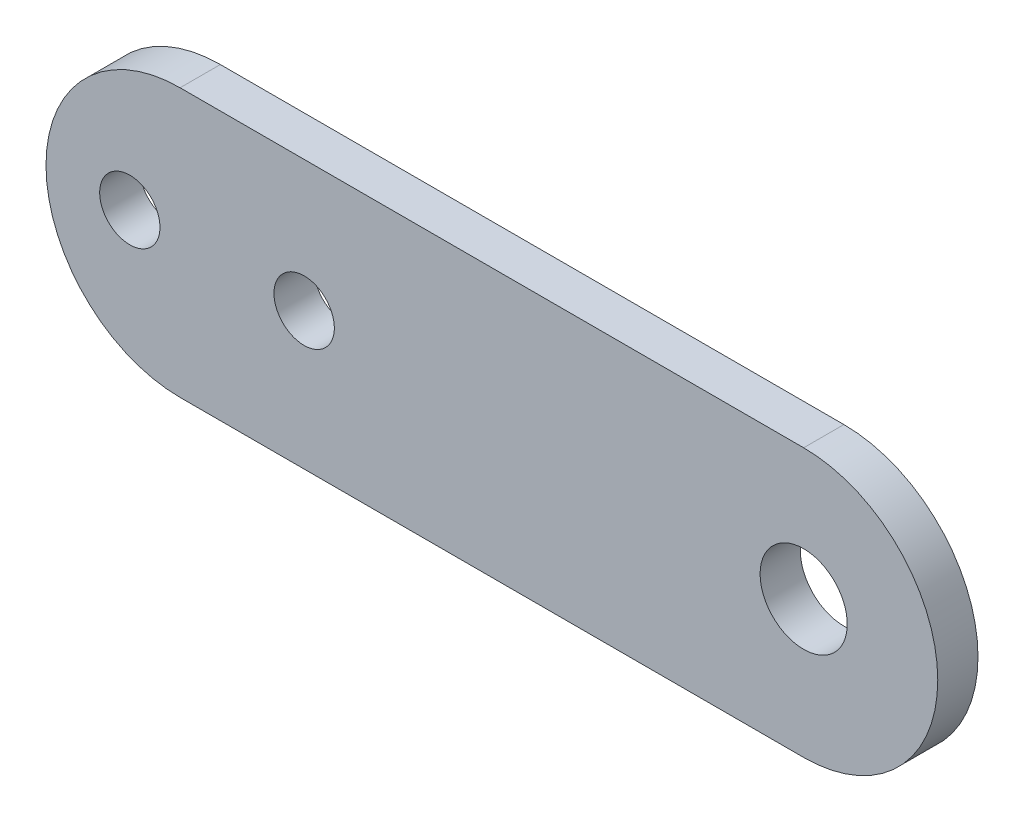
ISO-10303-21;
HEADER;
FILE_DESCRIPTION(('STEP AP214'),'2;1');
FILE_NAME('part.step','',(''),(''),'','','');
FILE_SCHEMA(('AUTOMOTIVE_DESIGN { 1 0 10303 214 1 1 1 1 }'));
ENDSEC;
DATA;
#1=APPLICATION_CONTEXT('core data for automotive mechanical design processes');
#2=APPLICATION_PROTOCOL_DEFINITION('international standard','automotive_design',2000,#1);
#3=PRODUCT_CONTEXT('',#1,'mechanical');
#4=PRODUCT('Part','Part','',(#3));
#5=PRODUCT_RELATED_PRODUCT_CATEGORY('part','',(#4));
#6=PRODUCT_DEFINITION_FORMATION('','',#4);
#7=PRODUCT_DEFINITION_CONTEXT('part definition',#1,'design');
#8=PRODUCT_DEFINITION('design','',#6,#7);
#9=PRODUCT_DEFINITION_SHAPE('','',#8);
#10=(LENGTH_UNIT() NAMED_UNIT(*) SI_UNIT(.MILLI.,.METRE.));
#11=(NAMED_UNIT(*) PLANE_ANGLE_UNIT() SI_UNIT($,.RADIAN.));
#12=(NAMED_UNIT(*) SI_UNIT($,.STERADIAN.) SOLID_ANGLE_UNIT());
#13=UNCERTAINTY_MEASURE_WITH_UNIT(LENGTH_MEASURE(1.E-05),#10,'distance_accuracy_value','');
#14=(GEOMETRIC_REPRESENTATION_CONTEXT(3) GLOBAL_UNCERTAINTY_ASSIGNED_CONTEXT((#13)) GLOBAL_UNIT_ASSIGNED_CONTEXT((#10,
#11,#12)) REPRESENTATION_CONTEXT('',''));
#15=CARTESIAN_POINT('',(0.,0.,0.));
#16=DIRECTION('',(0.,0.,1.));
#17=DIRECTION('',(1.,0.,0.));
#18=AXIS2_PLACEMENT_3D('',#15,#16,#17);
#19=CARTESIAN_POINT('',(-23.25,-0.231386828024561,3.));
#20=DIRECTION('',(0.,0.,-1.));
#21=DIRECTION('',(-1.,0.,0.));
#22=AXIS2_PLACEMENT_3D('',#19,#20,#21);
#23=CYLINDRICAL_SURFACE('',#22,10.);
#24=CARTESIAN_POINT('',(-23.25,-0.231386828024561,0.));
#25=DIRECTION('',(0.,0.,1.));
#26=DIRECTION('',(1.,0.,0.));
#27=AXIS2_PLACEMENT_3D('',#24,#25,#26);
#28=CIRCLE('',#27,10.);
#29=CARTESIAN_POINT('',(-23.25,9.76861317197544,0.));
#30=VERTEX_POINT('',#29);
#31=CARTESIAN_POINT('',(-23.25,-10.2313868280246,0.));
#32=VERTEX_POINT('',#31);
#33=EDGE_CURVE('E107',#30,#32,#28,.T.);
#34=ORIENTED_EDGE('',*,*,#33,.T.);
#35=DIRECTION('',(0.,0.,-1.));
#36=VECTOR('',#35,1.);
#37=CARTESIAN_POINT('',(-23.25,-10.2313868280246,3.));
#38=LINE('',#37,#36);
#39=CARTESIAN_POINT('',(-23.25,-10.2313868280246,3.));
#40=VERTEX_POINT('',#39);
#41=EDGE_CURVE('E11',#40,#32,#38,.T.);
#42=ORIENTED_EDGE('',*,*,#41,.F.);
#43=CARTESIAN_POINT('',(-23.25,-0.231386828024561,3.));
#44=DIRECTION('',(0.,0.,1.));
#45=DIRECTION('',(1.,0.,0.));
#46=AXIS2_PLACEMENT_3D('',#43,#44,#45);
#47=CIRCLE('',#46,10.);
#48=CARTESIAN_POINT('',(-23.25,9.76861317197544,3.));
#49=VERTEX_POINT('',#48);
#50=EDGE_CURVE('E91',#49,#40,#47,.T.);
#51=ORIENTED_EDGE('',*,*,#50,.F.);
#52=DIRECTION('',(0.,0.,-1.));
#53=VECTOR('',#52,1.);
#54=CARTESIAN_POINT('',(-23.25,9.76861317197544,3.));
#55=LINE('',#54,#53);
#56=EDGE_CURVE('E103',#49,#30,#55,.T.);
#57=ORIENTED_EDGE('',*,*,#56,.T.);
#58=EDGE_LOOP('',(#34,#42,#51,#57));
#59=FACE_BOUND('',#58,.T.);
#60=ADVANCED_FACE('F39',(#59),#23,.T.);
#61=CARTESIAN_POINT('',(-23.25,-10.2313868280246,3.));
#62=DIRECTION('',(0.,1.,0.));
#63=DIRECTION('',(0.,0.,1.));
#64=AXIS2_PLACEMENT_3D('',#61,#62,#63);
#65=PLANE('',#64);
#66=DIRECTION('',(1.,0.,0.));
#67=VECTOR('',#66,1.);
#68=CARTESIAN_POINT('',(-23.25,-10.2313868280246,0.));
#69=LINE('',#68,#67);
#70=CARTESIAN_POINT('',(23.25,-10.2313868280246,0.));
#71=VERTEX_POINT('',#70);
#72=EDGE_CURVE('E96',#32,#71,#69,.T.);
#73=ORIENTED_EDGE('',*,*,#72,.T.);
#74=DIRECTION('',(0.,0.,-1.));
#75=VECTOR('',#74,1.);
#76=CARTESIAN_POINT('',(23.25,-10.2313868280246,3.));
#77=LINE('',#76,#75);
#78=CARTESIAN_POINT('',(23.25,-10.2313868280246,3.));
#79=VERTEX_POINT('',#78);
#80=EDGE_CURVE('E48',#79,#71,#77,.T.);
#81=ORIENTED_EDGE('',*,*,#80,.F.);
#82=DIRECTION('',(1.,0.,0.));
#83=VECTOR('',#82,1.);
#84=CARTESIAN_POINT('',(-23.25,-10.2313868280246,3.));
#85=LINE('',#84,#83);
#86=EDGE_CURVE('E86',#40,#79,#85,.T.);
#87=ORIENTED_EDGE('',*,*,#86,.F.);
#88=ORIENTED_EDGE('',*,*,#41,.T.);
#89=EDGE_LOOP('',(#73,#81,#87,#88));
#90=FACE_BOUND('',#89,.T.);
#91=ADVANCED_FACE('F95',(#90),#65,.F.);
#92=CARTESIAN_POINT('',(23.25,-0.231386828024565,3.));
#93=DIRECTION('',(0.,0.,-1.));
#94=DIRECTION('',(-1.,0.,0.));
#95=AXIS2_PLACEMENT_3D('',#92,#93,#94);
#96=CYLINDRICAL_SURFACE('',#95,10.);
#97=CARTESIAN_POINT('',(23.25,-0.231386828024565,0.));
#98=DIRECTION('',(0.,0.,1.));
#99=DIRECTION('',(1.,0.,0.));
#100=AXIS2_PLACEMENT_3D('',#97,#98,#99);
#101=CIRCLE('',#100,10.);
#102=CARTESIAN_POINT('',(23.25,9.76861317197544,0.));
#103=VERTEX_POINT('',#102);
#104=EDGE_CURVE('E73',#71,#103,#101,.T.);
#105=ORIENTED_EDGE('',*,*,#104,.T.);
#106=DIRECTION('',(0.,0.,-1.));
#107=VECTOR('',#106,1.);
#108=CARTESIAN_POINT('',(23.25,9.76861317197544,3.));
#109=LINE('',#108,#107);
#110=CARTESIAN_POINT('',(23.25,9.76861317197544,3.));
#111=VERTEX_POINT('',#110);
#112=EDGE_CURVE('E98',#111,#103,#109,.T.);
#113=ORIENTED_EDGE('',*,*,#112,.F.);
#114=CARTESIAN_POINT('',(23.25,-0.231386828024565,3.));
#115=DIRECTION('',(0.,0.,1.));
#116=DIRECTION('',(1.,0.,0.));
#117=AXIS2_PLACEMENT_3D('',#114,#115,#116);
#118=CIRCLE('',#117,10.);
#119=EDGE_CURVE('E89',#79,#111,#118,.T.);
#120=ORIENTED_EDGE('',*,*,#119,.F.);
#121=ORIENTED_EDGE('',*,*,#80,.T.);
#122=EDGE_LOOP('',(#105,#113,#120,#121));
#123=FACE_BOUND('',#122,.T.);
#124=ADVANCED_FACE('F99',(#123),#96,.T.);
#125=CARTESIAN_POINT('',(-23.25,9.76861317197544,3.));
#126=DIRECTION('',(0.,-1.,0.));
#127=DIRECTION('',(1.,0.,0.));
#128=AXIS2_PLACEMENT_3D('',#125,#126,#127);
#129=PLANE('',#128);
#130=DIRECTION('',(-1.,0.,0.));
#131=VECTOR('',#130,1.);
#132=CARTESIAN_POINT('',(-23.25,9.76861317197544,0.));
#133=LINE('',#132,#131);
#134=EDGE_CURVE('E79',#103,#30,#133,.T.);
#135=ORIENTED_EDGE('',*,*,#134,.T.);
#136=ORIENTED_EDGE('',*,*,#56,.F.);
#137=DIRECTION('',(-1.,0.,0.));
#138=VECTOR('',#137,1.);
#139=CARTESIAN_POINT('',(-23.25,9.76861317197544,3.));
#140=LINE('',#139,#138);
#141=EDGE_CURVE('E56',#111,#49,#140,.T.);
#142=ORIENTED_EDGE('',*,*,#141,.F.);
#143=ORIENTED_EDGE('',*,*,#112,.T.);
#144=EDGE_LOOP('',(#135,#136,#142,#143));
#145=FACE_BOUND('',#144,.T.);
#146=ADVANCED_FACE('F121',(#145),#129,.F.);
#147=CARTESIAN_POINT('',(-23.25,-0.231386828024561,3.));
#148=DIRECTION('',(0.,0.,1.));
#149=DIRECTION('',(1.,0.,0.));
#150=AXIS2_PLACEMENT_3D('',#147,#148,#149);
#151=PLANE('',#150);
#152=CARTESIAN_POINT('',(23.25,0.,3.));
#153=DIRECTION('',(0.,0.,-1.));
#154=DIRECTION('',(-1.,0.,0.));
#155=AXIS2_PLACEMENT_3D('',#152,#153,#154);
#156=CIRCLE('',#155,3.25);
#157=CARTESIAN_POINT('',(20.,0.,3.));
#158=VERTEX_POINT('',#157);
#159=EDGE_CURVE('E140',#158,#158,#156,.T.);
#160=ORIENTED_EDGE('',*,*,#159,.T.);
#161=EDGE_LOOP('',(#160));
#162=FACE_BOUND('',#161,.T.);
#163=CARTESIAN_POINT('',(-27.,0.,3.));
#164=DIRECTION('',(0.,0.,-1.));
#165=DIRECTION('',(-1.,0.,0.));
#166=AXIS2_PLACEMENT_3D('',#163,#164,#165);
#167=CIRCLE('',#166,2.25);
#168=CARTESIAN_POINT('',(-29.25,0.,3.));
#169=VERTEX_POINT('',#168);
#170=EDGE_CURVE('E132',#169,#169,#167,.T.);
#171=ORIENTED_EDGE('',*,*,#170,.T.);
#172=EDGE_LOOP('',(#171));
#173=FACE_BOUND('',#172,.T.);
#174=CARTESIAN_POINT('',(-14.,0.,3.));
#175=DIRECTION('',(0.,0.,-1.));
#176=DIRECTION('',(-1.,0.,0.));
#177=AXIS2_PLACEMENT_3D('',#174,#175,#176);
#178=CIRCLE('',#177,2.25);
#179=CARTESIAN_POINT('',(-16.25,0.,3.));
#180=VERTEX_POINT('',#179);
#181=EDGE_CURVE('E111',#180,#180,#178,.T.);
#182=ORIENTED_EDGE('',*,*,#181,.T.);
#183=EDGE_LOOP('',(#182));
#184=FACE_BOUND('',#183,.T.);
#185=ORIENTED_EDGE('',*,*,#50,.T.);
#186=ORIENTED_EDGE('',*,*,#86,.T.);
#187=ORIENTED_EDGE('',*,*,#119,.T.);
#188=ORIENTED_EDGE('',*,*,#141,.T.);
#189=EDGE_LOOP('',(#185,#186,#187,#188));
#190=FACE_BOUND('',#189,.T.);
#191=ADVANCED_FACE('F87',(#162,#173,#184,#190),#151,.T.);
#192=CARTESIAN_POINT('',(-23.25,-0.231386828024561,0.));
#193=DIRECTION('',(0.,0.,1.));
#194=DIRECTION('',(1.,0.,0.));
#195=AXIS2_PLACEMENT_3D('',#192,#193,#194);
#196=PLANE('',#195);
#197=CARTESIAN_POINT('',(23.25,0.,0.));
#198=DIRECTION('',(0.,0.,-1.));
#199=DIRECTION('',(-1.,0.,0.));
#200=AXIS2_PLACEMENT_3D('',#197,#198,#199);
#201=CIRCLE('',#200,3.25);
#202=CARTESIAN_POINT('',(20.,0.,0.));
#203=VERTEX_POINT('',#202);
#204=EDGE_CURVE('E136',#203,#203,#201,.T.);
#205=ORIENTED_EDGE('',*,*,#204,.F.);
#206=EDGE_LOOP('',(#205));
#207=FACE_BOUND('',#206,.T.);
#208=CARTESIAN_POINT('',(-27.,0.,0.));
#209=DIRECTION('',(0.,0.,-1.));
#210=DIRECTION('',(-1.,0.,0.));
#211=AXIS2_PLACEMENT_3D('',#208,#209,#210);
#212=CIRCLE('',#211,2.25);
#213=CARTESIAN_POINT('',(-29.25,0.,0.));
#214=VERTEX_POINT('',#213);
#215=EDGE_CURVE('E144',#214,#214,#212,.T.);
#216=ORIENTED_EDGE('',*,*,#215,.F.);
#217=EDGE_LOOP('',(#216));
#218=FACE_BOUND('',#217,.T.);
#219=CARTESIAN_POINT('',(-14.,0.,0.));
#220=DIRECTION('',(0.,0.,-1.));
#221=DIRECTION('',(-1.,0.,0.));
#222=AXIS2_PLACEMENT_3D('',#219,#220,#221);
#223=CIRCLE('',#222,2.25);
#224=CARTESIAN_POINT('',(-16.25,0.,0.));
#225=VERTEX_POINT('',#224);
#226=EDGE_CURVE('E128',#225,#225,#223,.T.);
#227=ORIENTED_EDGE('',*,*,#226,.F.);
#228=EDGE_LOOP('',(#227));
#229=FACE_BOUND('',#228,.T.);
#230=ORIENTED_EDGE('',*,*,#33,.F.);
#231=ORIENTED_EDGE('',*,*,#134,.F.);
#232=ORIENTED_EDGE('',*,*,#104,.F.);
#233=ORIENTED_EDGE('',*,*,#72,.F.);
#234=EDGE_LOOP('',(#230,#231,#232,#233));
#235=FACE_BOUND('',#234,.T.);
#236=ADVANCED_FACE('F124',(#207,#218,#229,#235),#196,.F.);
#237=CARTESIAN_POINT('',(-14.,0.,3.));
#238=DIRECTION('',(0.,0.,-1.));
#239=DIRECTION('',(-1.,0.,0.));
#240=AXIS2_PLACEMENT_3D('',#237,#238,#239);
#241=CYLINDRICAL_SURFACE('',#240,2.25);
#242=ORIENTED_EDGE('',*,*,#181,.F.);
#243=EDGE_LOOP('',(#242));
#244=FACE_BOUND('',#243,.T.);
#245=ORIENTED_EDGE('',*,*,#226,.T.);
#246=EDGE_LOOP('',(#245));
#247=FACE_BOUND('',#246,.T.);
#248=ADVANCED_FACE('F158',(#244,#247),#241,.F.);
#249=CARTESIAN_POINT('',(-27.,0.,3.));
#250=DIRECTION('',(0.,0.,-1.));
#251=DIRECTION('',(-1.,0.,0.));
#252=AXIS2_PLACEMENT_3D('',#249,#250,#251);
#253=CYLINDRICAL_SURFACE('',#252,2.25);
#254=ORIENTED_EDGE('',*,*,#170,.F.);
#255=EDGE_LOOP('',(#254));
#256=FACE_BOUND('',#255,.T.);
#257=ORIENTED_EDGE('',*,*,#215,.T.);
#258=EDGE_LOOP('',(#257));
#259=FACE_BOUND('',#258,.T.);
#260=ADVANCED_FACE('F154',(#256,#259),#253,.F.);
#261=CARTESIAN_POINT('',(23.25,0.,3.));
#262=DIRECTION('',(0.,0.,-1.));
#263=DIRECTION('',(-1.,0.,0.));
#264=AXIS2_PLACEMENT_3D('',#261,#262,#263);
#265=CYLINDRICAL_SURFACE('',#264,3.25);
#266=ORIENTED_EDGE('',*,*,#159,.F.);
#267=EDGE_LOOP('',(#266));
#268=FACE_BOUND('',#267,.T.);
#269=ORIENTED_EDGE('',*,*,#204,.T.);
#270=EDGE_LOOP('',(#269));
#271=FACE_BOUND('',#270,.T.);
#272=ADVANCED_FACE('F157',(#268,#271),#265,.F.);
#273=CLOSED_SHELL('',(#60,#91,#124,#146,#191,#236,#248,#260,#272));
#274=MANIFOLD_SOLID_BREP('B2',#273);
#275=ADVANCED_BREP_SHAPE_REPRESENTATION('',(#18,#274),#14);
#276=SHAPE_DEFINITION_REPRESENTATION(#9,#275);
ENDSEC;
END-ISO-10303-21;
